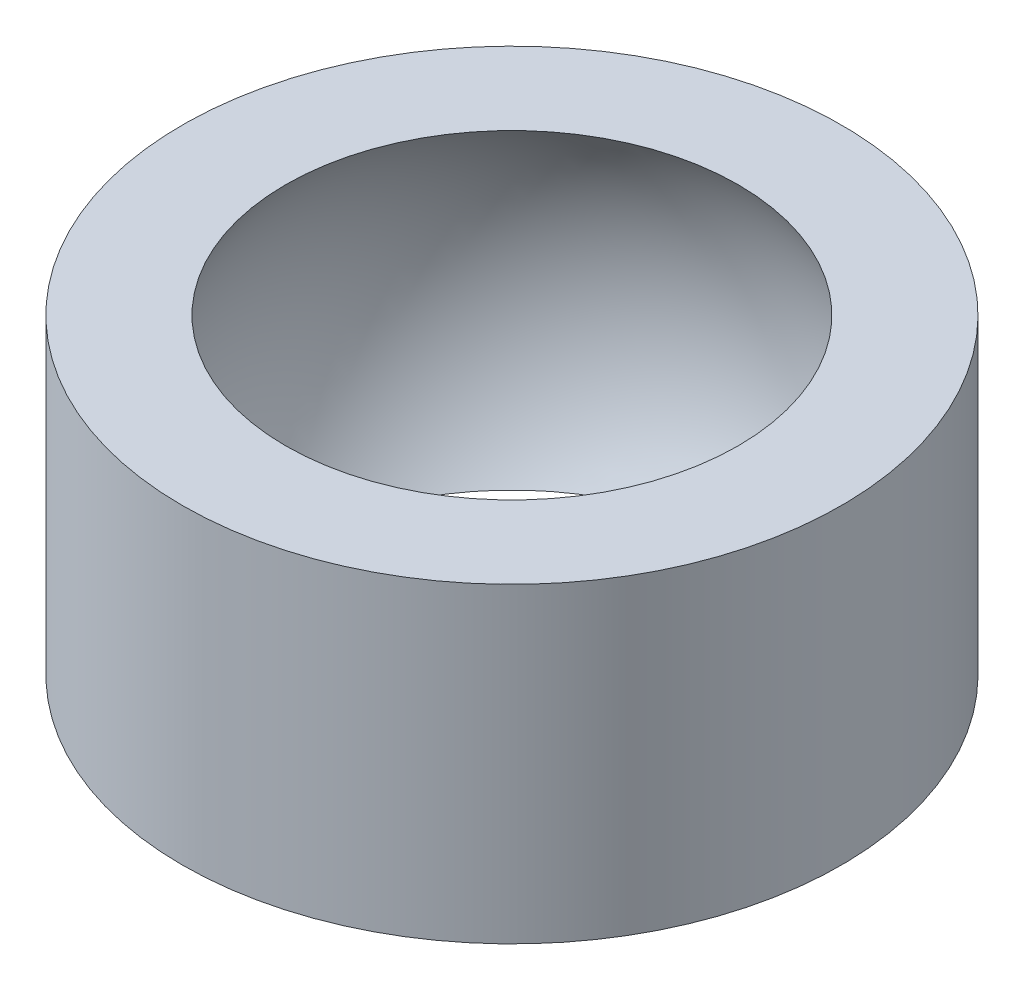
ISO-10303-21;
HEADER;
FILE_DESCRIPTION(('STEP AP214'),'2;1');
FILE_NAME('part.step','',(''),(''),'','','');
FILE_SCHEMA(('AUTOMOTIVE_DESIGN { 1 0 10303 214 1 1 1 1 }'));
ENDSEC;
DATA;
#1=APPLICATION_CONTEXT('core data for automotive mechanical design processes');
#2=APPLICATION_PROTOCOL_DEFINITION('international standard','automotive_design',2000,#1);
#3=PRODUCT_CONTEXT('',#1,'mechanical');
#4=PRODUCT('Part','Part','',(#3));
#5=PRODUCT_RELATED_PRODUCT_CATEGORY('part','',(#4));
#6=PRODUCT_DEFINITION_FORMATION('','',#4);
#7=PRODUCT_DEFINITION_CONTEXT('part definition',#1,'design');
#8=PRODUCT_DEFINITION('design','',#6,#7);
#9=PRODUCT_DEFINITION_SHAPE('','',#8);
#10=(LENGTH_UNIT() NAMED_UNIT(*) SI_UNIT(.MILLI.,.METRE.));
#11=(NAMED_UNIT(*) PLANE_ANGLE_UNIT() SI_UNIT($,.RADIAN.));
#12=(NAMED_UNIT(*) SI_UNIT($,.STERADIAN.) SOLID_ANGLE_UNIT());
#13=UNCERTAINTY_MEASURE_WITH_UNIT(LENGTH_MEASURE(1.E-05),#10,'distance_accuracy_value','');
#14=(GEOMETRIC_REPRESENTATION_CONTEXT(3) GLOBAL_UNCERTAINTY_ASSIGNED_CONTEXT((#13)) GLOBAL_UNIT_ASSIGNED_CONTEXT((#10,
#11,#12)) REPRESENTATION_CONTEXT('',''));
#15=CARTESIAN_POINT('',(0.,0.,0.));
#16=DIRECTION('',(0.,0.,1.));
#17=DIRECTION('',(1.,0.,0.));
#18=AXIS2_PLACEMENT_3D('',#15,#16,#17);
#19=CARTESIAN_POINT('',(0.,0.,0.));
#20=DIRECTION('',(0.,1.,0.));
#21=DIRECTION('',(0.,0.,1.));
#22=AXIS2_PLACEMENT_3D('',#19,#20,#21);
#23=CYLINDRICAL_SURFACE('',#22,9.525);
#24=CARTESIAN_POINT('',(0.,4.5,0.));
#25=DIRECTION('',(0.,1.,0.));
#26=DIRECTION('',(0.,0.,1.));
#27=AXIS2_PLACEMENT_3D('',#24,#25,#26);
#28=CIRCLE('',#27,9.525);
#29=CARTESIAN_POINT('',(0.,4.5,9.525));
#30=VERTEX_POINT('',#29);
#31=EDGE_CURVE('E10',#30,#30,#28,.T.);
#32=ORIENTED_EDGE('',*,*,#31,.F.);
#33=EDGE_LOOP('',(#32));
#34=FACE_BOUND('',#33,.T.);
#35=CARTESIAN_POINT('',(0.,-4.5,0.));
#36=DIRECTION('',(0.,1.,0.));
#37=DIRECTION('',(0.,0.,1.));
#38=AXIS2_PLACEMENT_3D('',#35,#36,#37);
#39=CIRCLE('',#38,9.525);
#40=CARTESIAN_POINT('',(0.,-4.5,9.525));
#41=VERTEX_POINT('',#40);
#42=EDGE_CURVE('E46',#41,#41,#39,.T.);
#43=ORIENTED_EDGE('',*,*,#42,.T.);
#44=EDGE_LOOP('',(#43));
#45=FACE_BOUND('',#44,.T.);
#46=ADVANCED_FACE('F32',(#34,#45),#23,.T.);
#47=CARTESIAN_POINT('',(9.525,4.5,0.));
#48=DIRECTION('',(0.,-1.,0.));
#49=DIRECTION('',(0.,0.,-1.));
#50=AXIS2_PLACEMENT_3D('',#47,#48,#49);
#51=PLANE('',#50);
#52=CARTESIAN_POINT('',(0.,4.5,0.));
#53=DIRECTION('',(0.,1.,0.));
#54=DIRECTION('',(0.,0.,1.));
#55=AXIS2_PLACEMENT_3D('',#52,#53,#54);
#56=CIRCLE('',#55,6.53864712689101);
#57=CARTESIAN_POINT('',(6.53864712689101,4.5,0.));
#58=VERTEX_POINT('',#57);
#59=EDGE_CURVE('E38',#58,#58,#56,.T.);
#60=ORIENTED_EDGE('',*,*,#59,.F.);
#61=EDGE_LOOP('',(#60));
#62=FACE_BOUND('',#61,.T.);
#63=ORIENTED_EDGE('',*,*,#31,.T.);
#64=EDGE_LOOP('',(#63));
#65=FACE_BOUND('',#64,.T.);
#66=ADVANCED_FACE('F61',(#62,#65),#51,.F.);
#67=CARTESIAN_POINT('',(0.,0.,0.));
#68=DIRECTION('',(0.,1.,0.));
#69=DIRECTION('',(1.,0.,0.));
#70=AXIS2_PLACEMENT_3D('',#67,#68,#69);
#71=SPHERICAL_SURFACE('',#70,7.9375);
#72=CARTESIAN_POINT('',(0.,-4.5,0.));
#73=DIRECTION('',(0.,1.,0.));
#74=DIRECTION('',(0.,0.,1.));
#75=AXIS2_PLACEMENT_3D('',#72,#73,#74);
#76=CIRCLE('',#75,6.53864712689101);
#77=CARTESIAN_POINT('',(6.53864712689101,-4.5,0.));
#78=VERTEX_POINT('',#77);
#79=EDGE_CURVE('E42',#78,#78,#76,.T.);
#80=CARTESIAN_POINT('',(6.53864712689101,-4.5,0.));
#81=CARTESIAN_POINT('',(6.59515792354564,-4.4178896516611,0.));
#82=CARTESIAN_POINT('',(6.65012044277307,-4.33471383018286,0.));
#83=CARTESIAN_POINT('',(6.75687447746737,-4.16635152709133,0.));
#84=CARTESIAN_POINT('',(6.80866599293423,-4.08116504547805,0.));
#85=CARTESIAN_POINT('',(6.90900357120122,-3.90890170826011,0.));
#86=CARTESIAN_POINT('',(6.95754963400136,-3.82182485265546,0.));
#87=CARTESIAN_POINT('',(7.05132766946198,-3.64590450080333,0.));
#88=CARTESIAN_POINT('',(7.09655964212247,-3.55706100455585,0.));
#89=CARTESIAN_POINT('',(7.18364523980874,-3.37773340696553,0.));
#90=CARTESIAN_POINT('',(7.22549886483452,-3.28724930562268,0.));
#91=CARTESIAN_POINT('',(7.30576839057941,-3.10476891648331,0.));
#92=CARTESIAN_POINT('',(7.34418429129851,-3.01277262868678,0.));
#93=CARTESIAN_POINT('',(7.41752384707613,-2.82739841653475,0.));
#94=CARTESIAN_POINT('',(7.45244750213464,-2.73402049217924,0.));
#95=CARTESIAN_POINT('',(7.51875300733912,-2.54601552144157,0.));
#96=CARTESIAN_POINT('',(7.55013485748508,-2.45138847505941,0.));
#97=CARTESIAN_POINT('',(7.60931221816365,-2.26101954638836,0.));
#98=CARTESIAN_POINT('',(7.63710772869625,-2.16527766409947,0.));
#99=CARTESIAN_POINT('',(7.68907296530984,-1.97281493209444,0.));
#100=CARTESIAN_POINT('',(7.71324269139083,-1.87609408237831,0.));
#101=CARTESIAN_POINT('',(7.75792205953626,-1.68181067318655,0.));
#102=CARTESIAN_POINT('',(7.77843170160072,-1.58424811371093,0.));
#103=CARTESIAN_POINT('',(7.81576179624805,-1.38841973716836,0.));
#104=CARTESIAN_POINT('',(7.83258224883093,-1.29015392010142,0.));
#105=CARTESIAN_POINT('',(7.86251009441324,-1.09305847854001,0.));
#106=CARTESIAN_POINT('',(7.87561748741267,-0.994228854045525,0.));
#107=CARTESIAN_POINT('',(7.89810061297456,-0.796146047899934,0.));
#108=CARTESIAN_POINT('',(7.90747634553703,-0.696892866248824,0.));
#109=CARTESIAN_POINT('',(7.92248284501367,-0.498103797135389,0.));
#110=CARTESIAN_POINT('',(7.92811361192782,-0.398567909673065,0.));
#111=CARTESIAN_POINT('',(7.93562218942099,-0.199354681473827,0.));
#112=CARTESIAN_POINT('',(7.9375,-0.0996773407369134,0.));
#113=CARTESIAN_POINT('',(7.9375,0.0996773407369134,0.));
#114=CARTESIAN_POINT('',(7.93562218942099,0.199354681473827,0.));
#115=CARTESIAN_POINT('',(7.92811361192782,0.398567909673065,0.));
#116=CARTESIAN_POINT('',(7.92248284501367,0.498103797135389,0.));
#117=CARTESIAN_POINT('',(7.90747634553703,0.696892866248824,0.));
#118=CARTESIAN_POINT('',(7.89810061297456,0.796146047899933,0.));
#119=CARTESIAN_POINT('',(7.87561748741267,0.994228854045524,0.));
#120=CARTESIAN_POINT('',(7.86251009441324,1.09305847854,0.));
#121=CARTESIAN_POINT('',(7.83258224883093,1.29015392010142,0.));
#122=CARTESIAN_POINT('',(7.81576179624805,1.38841973716836,0.));
#123=CARTESIAN_POINT('',(7.77843170160072,1.58424811371093,0.));
#124=CARTESIAN_POINT('',(7.75792205953626,1.68181067318655,0.));
#125=CARTESIAN_POINT('',(7.71324269139083,1.87609408237831,0.));
#126=CARTESIAN_POINT('',(7.68907296530984,1.97281493209444,0.));
#127=CARTESIAN_POINT('',(7.63710772869625,2.16527766409947,0.));
#128=CARTESIAN_POINT('',(7.60931221816365,2.26101954638836,0.));
#129=CARTESIAN_POINT('',(7.55013485748508,2.45138847505941,0.));
#130=CARTESIAN_POINT('',(7.51875300733912,2.54601552144157,0.));
#131=CARTESIAN_POINT('',(7.45244750213464,2.73402049217924,0.));
#132=CARTESIAN_POINT('',(7.41752384707613,2.82739841653475,0.));
#133=CARTESIAN_POINT('',(7.34418429129851,3.01277262868678,0.));
#134=CARTESIAN_POINT('',(7.30576839057941,3.10476891648331,0.));
#135=CARTESIAN_POINT('',(7.22549886483452,3.28724930562268,0.));
#136=CARTESIAN_POINT('',(7.18364523980874,3.37773340696553,0.));
#137=CARTESIAN_POINT('',(7.09655964212247,3.55706100455585,0.));
#138=CARTESIAN_POINT('',(7.05132766946198,3.64590450080333,0.));
#139=CARTESIAN_POINT('',(6.95754963400136,3.82182485265546,0.));
#140=CARTESIAN_POINT('',(6.90900357120122,3.90890170826011,0.));
#141=CARTESIAN_POINT('',(6.80866599293423,4.08116504547805,0.));
#142=CARTESIAN_POINT('',(6.75687447746737,4.16635152709133,0.));
#143=CARTESIAN_POINT('',(6.65012044277307,4.33471383018286,0.));
#144=CARTESIAN_POINT('',(6.59515792354564,4.4178896516611,0.));
#145=CARTESIAN_POINT('',(6.53864712689101,4.5,0.));
#146=B_SPLINE_CURVE_WITH_KNOTS('',3,(#80,#81,#82,#83,#84,#85,#86,#87,#88,#89,#90,#91,#92,#93,
#94,#95,#96,#97,#98,#99,#100,#101,#102,#103,#104,#105,#106,#107,#108,#109,#110,#111,#112,#113,
#114,#115,#116,#117,#118,#119,#120,#121,#122,#123,#124,#125,#126,#127,#128,#129,#130,#131,#132,
#133,#134,#135,#136,#137,#138,#139,#140,#141,#142,#143,#144,#145),.UNSPECIFIED.,.F.,.F.,(4,2,2,
2,2,2,2,2,2,2,2,2,2,2,2,2,2,2,2,2,2,2,2,2,2,2,2,2,2,2,2,2,4),(0.,0.299014342120518,
0.598028684241037,0.897043026361555,1.19605736848207,1.49507171060259,1.79408605272311,
2.09310039484363,2.39211473696415,2.69112907908467,2.99014342120519,3.2891577633257,
3.58817210544622,3.88718644756674,4.18620078968726,4.48521513180778,4.7842294739283,
5.08324381604882,5.38225815816933,5.68127250028985,5.98028684241037,6.27930118453089,
6.57831552665141,6.87732986877193,7.17634421089245,7.47535855301297,7.77437289513348,
8.073387237254,8.37240157937452,8.67141592149504,8.97043026361556,9.26944460573608,
9.56845894785659),.UNSPECIFIED.);
#147=EDGE_CURVE('BSEAM56',#78,#58,#146,.T.);
#148=ORIENTED_EDGE('',*,*,#79,.F.);
#149=ORIENTED_EDGE('',*,*,#59,.T.);
#150=ORIENTED_EDGE('',*,*,#147,.T.);
#151=ORIENTED_EDGE('',*,*,#147,.F.);
#152=EDGE_LOOP('',(#148,#150,#149,#151));
#153=FACE_BOUND('',#152,.T.);
#154=ADVANCED_FACE('F56',(#153),#71,.F.);
#155=CARTESIAN_POINT('',(6.53864712689101,-4.5,0.));
#156=DIRECTION('',(0.,1.,0.));
#157=DIRECTION('',(0.,0.,1.));
#158=AXIS2_PLACEMENT_3D('',#155,#156,#157);
#159=PLANE('',#158);
#160=ORIENTED_EDGE('',*,*,#42,.F.);
#161=EDGE_LOOP('',(#160));
#162=FACE_BOUND('',#161,.T.);
#163=ORIENTED_EDGE('',*,*,#79,.T.);
#164=EDGE_LOOP('',(#163));
#165=FACE_BOUND('',#164,.T.);
#166=ADVANCED_FACE('F53',(#162,#165),#159,.F.);
#167=CLOSED_SHELL('',(#46,#66,#154,#166));
#168=MANIFOLD_SOLID_BREP('B2',#167);
#169=ADVANCED_BREP_SHAPE_REPRESENTATION('',(#18,#168),#14);
#170=SHAPE_DEFINITION_REPRESENTATION(#9,#169);
ENDSEC;
END-ISO-10303-21;
